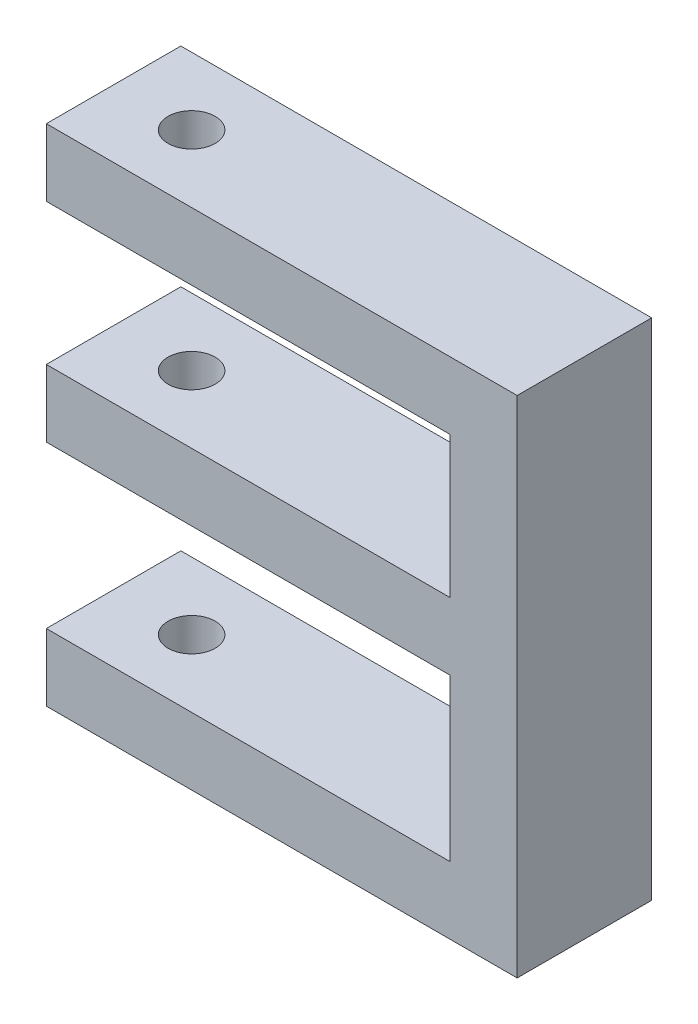
ISO-10303-21;
HEADER;
FILE_DESCRIPTION(('STEP AP214'),'2;1');
FILE_NAME('part.step','',(''),(''),'','','');
FILE_SCHEMA(('AUTOMOTIVE_DESIGN { 1 0 10303 214 1 1 1 1 }'));
ENDSEC;
DATA;
#1=APPLICATION_CONTEXT('core data for automotive mechanical design processes');
#2=APPLICATION_PROTOCOL_DEFINITION('international standard','automotive_design',2000,#1);
#3=PRODUCT_CONTEXT('',#1,'mechanical');
#4=PRODUCT('Part','Part','',(#3));
#5=PRODUCT_RELATED_PRODUCT_CATEGORY('part','',(#4));
#6=PRODUCT_DEFINITION_FORMATION('','',#4);
#7=PRODUCT_DEFINITION_CONTEXT('part definition',#1,'design');
#8=PRODUCT_DEFINITION('design','',#6,#7);
#9=PRODUCT_DEFINITION_SHAPE('','',#8);
#10=(LENGTH_UNIT() NAMED_UNIT(*) SI_UNIT(.MILLI.,.METRE.));
#11=(NAMED_UNIT(*) PLANE_ANGLE_UNIT() SI_UNIT($,.RADIAN.));
#12=(NAMED_UNIT(*) SI_UNIT($,.STERADIAN.) SOLID_ANGLE_UNIT());
#13=UNCERTAINTY_MEASURE_WITH_UNIT(LENGTH_MEASURE(1.E-05),#10,'distance_accuracy_value','');
#14=(GEOMETRIC_REPRESENTATION_CONTEXT(3) GLOBAL_UNCERTAINTY_ASSIGNED_CONTEXT((#13)) GLOBAL_UNIT_ASSIGNED_CONTEXT((#10,
#11,#12)) REPRESENTATION_CONTEXT('',''));
#15=CARTESIAN_POINT('',(0.,0.,0.));
#16=DIRECTION('',(0.,0.,1.));
#17=DIRECTION('',(1.,0.,0.));
#18=AXIS2_PLACEMENT_3D('',#15,#16,#17);
#19=CARTESIAN_POINT('',(30.,-32.5,10.));
#20=DIRECTION('',(1.,0.,0.));
#21=DIRECTION('',(0.,0.,-1.));
#22=AXIS2_PLACEMENT_3D('',#19,#20,#21);
#23=PLANE('',#22);
#24=DIRECTION('',(0.,0.,-1.));
#25=VECTOR('',#24,1.);
#26=CARTESIAN_POINT('',(30.,-15.5,0.));
#27=LINE('',#26,#25);
#28=CARTESIAN_POINT('',(30.,-15.5,10.));
#29=VERTEX_POINT('',#28);
#30=CARTESIAN_POINT('',(30.,-15.5,0.));
#31=VERTEX_POINT('',#30);
#32=EDGE_CURVE('E57',#29,#31,#27,.T.);
#33=ORIENTED_EDGE('',*,*,#32,.F.);
#34=DIRECTION('',(0.,-1.,0.));
#35=VECTOR('',#34,1.);
#36=CARTESIAN_POINT('',(30.,-32.5,10.));
#37=LINE('',#36,#35);
#38=CARTESIAN_POINT('',(30.,-5.,10.));
#39=VERTEX_POINT('',#38);
#40=EDGE_CURVE('E163',#39,#29,#37,.T.);
#41=ORIENTED_EDGE('',*,*,#40,.F.);
#42=DIRECTION('',(0.,0.,-1.));
#43=VECTOR('',#42,1.);
#44=CARTESIAN_POINT('',(30.,-5.,10.));
#45=LINE('',#44,#43);
#46=CARTESIAN_POINT('',(30.,-5.,0.));
#47=VERTEX_POINT('',#46);
#48=EDGE_CURVE('E42',#39,#47,#45,.T.);
#49=ORIENTED_EDGE('',*,*,#48,.T.);
#50=DIRECTION('',(0.,-1.,0.));
#51=VECTOR('',#50,1.);
#52=CARTESIAN_POINT('',(30.,-32.5,0.));
#53=LINE('',#52,#51);
#54=EDGE_CURVE('E135',#47,#31,#53,.T.);
#55=ORIENTED_EDGE('',*,*,#54,.T.);
#56=EDGE_LOOP('',(#33,#41,#49,#55));
#57=FACE_BOUND('',#56,.T.);
#58=ADVANCED_FACE('F33',(#57),#23,.F.);
#59=DIRECTION('',(0.,0.,1.));
#60=VECTOR('',#59,1.);
#61=CARTESIAN_POINT('',(30.,-20.5,0.));
#62=LINE('',#61,#60);
#63=CARTESIAN_POINT('',(30.,-20.5,0.));
#64=VERTEX_POINT('',#63);
#65=CARTESIAN_POINT('',(30.,-20.5,10.));
#66=VERTEX_POINT('',#65);
#67=EDGE_CURVE('E139',#64,#66,#62,.T.);
#68=ORIENTED_EDGE('',*,*,#67,.F.);
#69=CARTESIAN_POINT('',(30.,-32.5,0.));
#70=VERTEX_POINT('',#69);
#71=EDGE_CURVE('E125',#64,#70,#53,.T.);
#72=ORIENTED_EDGE('',*,*,#71,.T.);
#73=DIRECTION('',(0.,0.,-1.));
#74=VECTOR('',#73,1.);
#75=CARTESIAN_POINT('',(30.,-32.5,10.));
#76=LINE('',#75,#74);
#77=CARTESIAN_POINT('',(30.,-32.5,10.));
#78=VERTEX_POINT('',#77);
#79=EDGE_CURVE('E203',#78,#70,#76,.T.);
#80=ORIENTED_EDGE('',*,*,#79,.F.);
#81=EDGE_CURVE('E49',#66,#78,#37,.T.);
#82=ORIENTED_EDGE('',*,*,#81,.F.);
#83=EDGE_LOOP('',(#68,#72,#80,#82));
#84=FACE_BOUND('',#83,.T.);
#85=ADVANCED_FACE('F140',(#84),#23,.F.);
#86=CARTESIAN_POINT('',(0.,-5.,10.));
#87=DIRECTION('',(1.,0.,0.));
#88=DIRECTION('',(0.,0.,-1.));
#89=AXIS2_PLACEMENT_3D('',#86,#87,#88);
#90=PLANE('',#89);
#91=DIRECTION('',(0.,-1.,0.));
#92=VECTOR('',#91,1.);
#93=CARTESIAN_POINT('',(0.,-5.,0.));
#94=LINE('',#93,#92);
#95=CARTESIAN_POINT('',(0.,0.,0.));
#96=VERTEX_POINT('',#95);
#97=CARTESIAN_POINT('',(0.,-5.,0.));
#98=VERTEX_POINT('',#97);
#99=EDGE_CURVE('E176',#96,#98,#94,.T.);
#100=ORIENTED_EDGE('',*,*,#99,.T.);
#101=DIRECTION('',(0.,0.,-1.));
#102=VECTOR('',#101,1.);
#103=CARTESIAN_POINT('',(0.,-5.,10.));
#104=LINE('',#103,#102);
#105=CARTESIAN_POINT('',(0.,-5.,10.));
#106=VERTEX_POINT('',#105);
#107=EDGE_CURVE('E11',#106,#98,#104,.T.);
#108=ORIENTED_EDGE('',*,*,#107,.F.);
#109=DIRECTION('',(0.,-1.,0.));
#110=VECTOR('',#109,1.);
#111=CARTESIAN_POINT('',(0.,-5.,10.));
#112=LINE('',#111,#110);
#113=CARTESIAN_POINT('',(0.,0.,10.));
#114=VERTEX_POINT('',#113);
#115=EDGE_CURVE('E157',#114,#106,#112,.T.);
#116=ORIENTED_EDGE('',*,*,#115,.F.);
#117=DIRECTION('',(0.,0.,-1.));
#118=VECTOR('',#117,1.);
#119=CARTESIAN_POINT('',(0.,0.,10.));
#120=LINE('',#119,#118);
#121=EDGE_CURVE('E175',#114,#96,#120,.T.);
#122=ORIENTED_EDGE('',*,*,#121,.T.);
#123=EDGE_LOOP('',(#100,#108,#116,#122));
#124=FACE_BOUND('',#123,.T.);
#125=ADVANCED_FACE('F35',(#124),#90,.F.);
#126=CARTESIAN_POINT('',(30.,-5.,10.));
#127=DIRECTION('',(0.,1.,0.));
#128=DIRECTION('',(-1.,0.,0.));
#129=AXIS2_PLACEMENT_3D('',#126,#127,#128);
#130=PLANE('',#129);
#131=CARTESIAN_POINT('',(5.8,-5.,5.));
#132=DIRECTION('',(0.,1.,0.));
#133=DIRECTION('',(-1.,0.,0.));
#134=AXIS2_PLACEMENT_3D('',#131,#132,#133);
#135=CIRCLE('',#134,1.75);
#136=CARTESIAN_POINT('',(4.05,-5.,5.));
#137=VERTEX_POINT('',#136);
#138=EDGE_CURVE('E143',#137,#137,#135,.F.);
#139=ORIENTED_EDGE('',*,*,#138,.F.);
#140=EDGE_LOOP('',(#139));
#141=FACE_BOUND('',#140,.T.);
#142=DIRECTION('',(1.,0.,0.));
#143=VECTOR('',#142,1.);
#144=CARTESIAN_POINT('',(30.,-5.,0.));
#145=LINE('',#144,#143);
#146=EDGE_CURVE('E136',#98,#47,#145,.T.);
#147=ORIENTED_EDGE('',*,*,#146,.T.);
#148=ORIENTED_EDGE('',*,*,#48,.F.);
#149=DIRECTION('',(1.,0.,0.));
#150=VECTOR('',#149,1.);
#151=CARTESIAN_POINT('',(30.,-5.,10.));
#152=LINE('',#151,#150);
#153=EDGE_CURVE('E160',#106,#39,#152,.T.);
#154=ORIENTED_EDGE('',*,*,#153,.F.);
#155=ORIENTED_EDGE('',*,*,#107,.T.);
#156=EDGE_LOOP('',(#147,#148,#154,#155));
#157=FACE_BOUND('',#156,.T.);
#158=ADVANCED_FACE('F263',(#141,#157),#130,.F.);
#159=CARTESIAN_POINT('',(0.,-32.5,10.));
#160=DIRECTION('',(0.,-1.,0.));
#161=DIRECTION('',(0.,0.,-1.));
#162=AXIS2_PLACEMENT_3D('',#159,#160,#161);
#163=PLANE('',#162);
#164=CARTESIAN_POINT('',(5.8,-32.5,5.));
#165=DIRECTION('',(0.,-1.,0.));
#166=DIRECTION('',(0.,0.,-1.));
#167=AXIS2_PLACEMENT_3D('',#164,#165,#166);
#168=CIRCLE('',#167,1.75);
#169=CARTESIAN_POINT('',(5.8,-32.5,3.25));
#170=VERTEX_POINT('',#169);
#171=EDGE_CURVE('E225',#170,#170,#168,.F.);
#172=ORIENTED_EDGE('',*,*,#171,.F.);
#173=EDGE_LOOP('',(#172));
#174=FACE_BOUND('',#173,.T.);
#175=DIRECTION('',(-1.,0.,0.));
#176=VECTOR('',#175,1.);
#177=CARTESIAN_POINT('',(0.,-32.5,0.));
#178=LINE('',#177,#176);
#179=CARTESIAN_POINT('',(0.,-32.5,0.));
#180=VERTEX_POINT('',#179);
#181=EDGE_CURVE('E133',#70,#180,#178,.T.);
#182=ORIENTED_EDGE('',*,*,#181,.T.);
#183=DIRECTION('',(0.,0.,-1.));
#184=VECTOR('',#183,1.);
#185=CARTESIAN_POINT('',(0.,-32.5,10.));
#186=LINE('',#185,#184);
#187=CARTESIAN_POINT('',(0.,-32.5,10.));
#188=VERTEX_POINT('',#187);
#189=EDGE_CURVE('E200',#188,#180,#186,.T.);
#190=ORIENTED_EDGE('',*,*,#189,.F.);
#191=DIRECTION('',(-1.,0.,0.));
#192=VECTOR('',#191,1.);
#193=CARTESIAN_POINT('',(0.,-32.5,10.));
#194=LINE('',#193,#192);
#195=EDGE_CURVE('E165',#78,#188,#194,.T.);
#196=ORIENTED_EDGE('',*,*,#195,.F.);
#197=ORIENTED_EDGE('',*,*,#79,.T.);
#198=EDGE_LOOP('',(#182,#190,#196,#197));
#199=FACE_BOUND('',#198,.T.);
#200=ADVANCED_FACE('F261',(#174,#199),#163,.F.);
#201=CARTESIAN_POINT('',(0.,-37.5,10.));
#202=DIRECTION('',(1.,0.,0.));
#203=DIRECTION('',(0.,0.,-1.));
#204=AXIS2_PLACEMENT_3D('',#201,#202,#203);
#205=PLANE('',#204);
#206=DIRECTION('',(0.,-1.,0.));
#207=VECTOR('',#206,1.);
#208=CARTESIAN_POINT('',(0.,-37.5,0.));
#209=LINE('',#208,#207);
#210=CARTESIAN_POINT('',(0.,-37.5,0.));
#211=VERTEX_POINT('',#210);
#212=EDGE_CURVE('E182',#180,#211,#209,.T.);
#213=ORIENTED_EDGE('',*,*,#212,.T.);
#214=DIRECTION('',(0.,0.,-1.));
#215=VECTOR('',#214,1.);
#216=CARTESIAN_POINT('',(0.,-37.5,10.));
#217=LINE('',#216,#215);
#218=CARTESIAN_POINT('',(0.,-37.5,10.));
#219=VERTEX_POINT('',#218);
#220=EDGE_CURVE('E197',#219,#211,#217,.T.);
#221=ORIENTED_EDGE('',*,*,#220,.F.);
#222=DIRECTION('',(0.,-1.,0.));
#223=VECTOR('',#222,1.);
#224=CARTESIAN_POINT('',(0.,-37.5,10.));
#225=LINE('',#224,#223);
#226=EDGE_CURVE('E167',#188,#219,#225,.T.);
#227=ORIENTED_EDGE('',*,*,#226,.F.);
#228=ORIENTED_EDGE('',*,*,#189,.T.);
#229=EDGE_LOOP('',(#213,#221,#227,#228));
#230=FACE_BOUND('',#229,.T.);
#231=ADVANCED_FACE('F270',(#230),#205,.F.);
#232=CARTESIAN_POINT('',(35.,-37.5,10.));
#233=DIRECTION('',(0.,1.,0.));
#234=DIRECTION('',(-1.,0.,0.));
#235=AXIS2_PLACEMENT_3D('',#232,#233,#234);
#236=PLANE('',#235);
#237=CARTESIAN_POINT('',(5.8,-37.5,5.));
#238=DIRECTION('',(0.,1.,0.));
#239=DIRECTION('',(-1.,0.,0.));
#240=AXIS2_PLACEMENT_3D('',#237,#238,#239);
#241=CIRCLE('',#240,1.75);
#242=CARTESIAN_POINT('',(4.05,-37.5,5.));
#243=VERTEX_POINT('',#242);
#244=EDGE_CURVE('E228',#243,#243,#241,.F.);
#245=ORIENTED_EDGE('',*,*,#244,.F.);
#246=EDGE_LOOP('',(#245));
#247=FACE_BOUND('',#246,.T.);
#248=DIRECTION('',(1.,0.,0.));
#249=VECTOR('',#248,1.);
#250=CARTESIAN_POINT('',(35.,-37.5,0.));
#251=LINE('',#250,#249);
#252=CARTESIAN_POINT('',(35.,-37.5,0.));
#253=VERTEX_POINT('',#252);
#254=EDGE_CURVE('E184',#211,#253,#251,.T.);
#255=ORIENTED_EDGE('',*,*,#254,.T.);
#256=DIRECTION('',(0.,0.,-1.));
#257=VECTOR('',#256,1.);
#258=CARTESIAN_POINT('',(35.,-37.5,10.));
#259=LINE('',#258,#257);
#260=CARTESIAN_POINT('',(35.,-37.5,10.));
#261=VERTEX_POINT('',#260);
#262=EDGE_CURVE('E194',#261,#253,#259,.T.);
#263=ORIENTED_EDGE('',*,*,#262,.F.);
#264=DIRECTION('',(1.,0.,0.));
#265=VECTOR('',#264,1.);
#266=CARTESIAN_POINT('',(35.,-37.5,10.));
#267=LINE('',#266,#265);
#268=EDGE_CURVE('E169',#219,#261,#267,.T.);
#269=ORIENTED_EDGE('',*,*,#268,.F.);
#270=ORIENTED_EDGE('',*,*,#220,.T.);
#271=EDGE_LOOP('',(#255,#263,#269,#270));
#272=FACE_BOUND('',#271,.T.);
#273=ADVANCED_FACE('F290',(#247,#272),#236,.F.);
#274=CARTESIAN_POINT('',(35.,0.,10.));
#275=DIRECTION('',(-1.,0.,0.));
#276=DIRECTION('',(0.,-1.,0.));
#277=AXIS2_PLACEMENT_3D('',#274,#275,#276);
#278=PLANE('',#277);
#279=DIRECTION('',(0.,1.,0.));
#280=VECTOR('',#279,1.);
#281=CARTESIAN_POINT('',(35.,0.,0.));
#282=LINE('',#281,#280);
#283=CARTESIAN_POINT('',(35.,0.,0.));
#284=VERTEX_POINT('',#283);
#285=EDGE_CURVE('E186',#253,#284,#282,.T.);
#286=ORIENTED_EDGE('',*,*,#285,.T.);
#287=DIRECTION('',(0.,0.,-1.));
#288=VECTOR('',#287,1.);
#289=CARTESIAN_POINT('',(35.,0.,10.));
#290=LINE('',#289,#288);
#291=CARTESIAN_POINT('',(35.,0.,10.));
#292=VERTEX_POINT('',#291);
#293=EDGE_CURVE('E191',#292,#284,#290,.T.);
#294=ORIENTED_EDGE('',*,*,#293,.F.);
#295=DIRECTION('',(0.,1.,0.));
#296=VECTOR('',#295,1.);
#297=CARTESIAN_POINT('',(35.,0.,10.));
#298=LINE('',#297,#296);
#299=EDGE_CURVE('E171',#261,#292,#298,.T.);
#300=ORIENTED_EDGE('',*,*,#299,.F.);
#301=ORIENTED_EDGE('',*,*,#262,.T.);
#302=EDGE_LOOP('',(#286,#294,#300,#301));
#303=FACE_BOUND('',#302,.T.);
#304=ADVANCED_FACE('F286',(#303),#278,.F.);
#305=CARTESIAN_POINT('',(0.,0.,10.));
#306=DIRECTION('',(0.,-1.,0.));
#307=DIRECTION('',(0.,0.,-1.));
#308=AXIS2_PLACEMENT_3D('',#305,#306,#307);
#309=PLANE('',#308);
#310=CARTESIAN_POINT('',(5.8,0.,5.));
#311=DIRECTION('',(0.,-1.,0.));
#312=DIRECTION('',(0.,0.,-1.));
#313=AXIS2_PLACEMENT_3D('',#310,#311,#312);
#314=CIRCLE('',#313,1.75);
#315=CARTESIAN_POINT('',(5.8,0.,3.25));
#316=VERTEX_POINT('',#315);
#317=EDGE_CURVE('E231',#316,#316,#314,.F.);
#318=ORIENTED_EDGE('',*,*,#317,.F.);
#319=EDGE_LOOP('',(#318));
#320=FACE_BOUND('',#319,.T.);
#321=DIRECTION('',(-1.,0.,0.));
#322=VECTOR('',#321,1.);
#323=CARTESIAN_POINT('',(0.,0.,0.));
#324=LINE('',#323,#322);
#325=EDGE_CURVE('E161',#284,#96,#324,.T.);
#326=ORIENTED_EDGE('',*,*,#325,.T.);
#327=ORIENTED_EDGE('',*,*,#121,.F.);
#328=DIRECTION('',(-1.,0.,0.));
#329=VECTOR('',#328,1.);
#330=CARTESIAN_POINT('',(0.,0.,10.));
#331=LINE('',#330,#329);
#332=EDGE_CURVE('E173',#292,#114,#331,.T.);
#333=ORIENTED_EDGE('',*,*,#332,.F.);
#334=ORIENTED_EDGE('',*,*,#293,.T.);
#335=EDGE_LOOP('',(#326,#327,#333,#334));
#336=FACE_BOUND('',#335,.T.);
#337=ADVANCED_FACE('F281',(#320,#336),#309,.F.);
#338=CARTESIAN_POINT('',(0.,0.,10.));
#339=DIRECTION('',(0.,0.,-1.));
#340=DIRECTION('',(-1.,0.,0.));
#341=AXIS2_PLACEMENT_3D('',#338,#339,#340);
#342=PLANE('',#341);
#343=ORIENTED_EDGE('',*,*,#115,.T.);
#344=ORIENTED_EDGE('',*,*,#153,.T.);
#345=ORIENTED_EDGE('',*,*,#40,.T.);
#346=DIRECTION('',(1.,0.,0.));
#347=VECTOR('',#346,1.);
#348=CARTESIAN_POINT('',(-11.1803398874989,-15.5,10.));
#349=LINE('',#348,#347);
#350=CARTESIAN_POINT('',(0.,-15.5,10.));
#351=VERTEX_POINT('',#350);
#352=EDGE_CURVE('E153',#351,#29,#349,.T.);
#353=ORIENTED_EDGE('',*,*,#352,.F.);
#354=DIRECTION('',(0.,-1.,0.));
#355=VECTOR('',#354,1.);
#356=CARTESIAN_POINT('',(0.,-15.5,10.));
#357=LINE('',#356,#355);
#358=CARTESIAN_POINT('',(0.,-20.5,10.));
#359=VERTEX_POINT('',#358);
#360=EDGE_CURVE('E151',#351,#359,#357,.T.);
#361=ORIENTED_EDGE('',*,*,#360,.T.);
#362=DIRECTION('',(1.,0.,0.));
#363=VECTOR('',#362,1.);
#364=CARTESIAN_POINT('',(-11.1803398874989,-20.5,10.));
#365=LINE('',#364,#363);
#366=EDGE_CURVE('E148',#359,#66,#365,.T.);
#367=ORIENTED_EDGE('',*,*,#366,.T.);
#368=ORIENTED_EDGE('',*,*,#81,.T.);
#369=ORIENTED_EDGE('',*,*,#195,.T.);
#370=ORIENTED_EDGE('',*,*,#226,.T.);
#371=ORIENTED_EDGE('',*,*,#268,.T.);
#372=ORIENTED_EDGE('',*,*,#299,.T.);
#373=ORIENTED_EDGE('',*,*,#332,.T.);
#374=EDGE_LOOP('',(#343,#344,#345,#353,#361,#367,#368,#369,#370,#371,#372,#373));
#375=FACE_BOUND('',#374,.T.);
#376=ADVANCED_FACE('F298',(#375),#342,.F.);
#377=CARTESIAN_POINT('',(0.,0.,0.));
#378=DIRECTION('',(0.,0.,-1.));
#379=DIRECTION('',(-1.,0.,0.));
#380=AXIS2_PLACEMENT_3D('',#377,#378,#379);
#381=PLANE('',#380);
#382=ORIENTED_EDGE('',*,*,#99,.F.);
#383=ORIENTED_EDGE('',*,*,#325,.F.);
#384=ORIENTED_EDGE('',*,*,#285,.F.);
#385=ORIENTED_EDGE('',*,*,#254,.F.);
#386=ORIENTED_EDGE('',*,*,#212,.F.);
#387=ORIENTED_EDGE('',*,*,#181,.F.);
#388=ORIENTED_EDGE('',*,*,#71,.F.);
#389=DIRECTION('',(1.,0.,0.));
#390=VECTOR('',#389,1.);
#391=CARTESIAN_POINT('',(-11.1803398874989,-20.5,0.));
#392=LINE('',#391,#390);
#393=CARTESIAN_POINT('',(0.,-20.5,0.));
#394=VERTEX_POINT('',#393);
#395=EDGE_CURVE('E130',#394,#64,#392,.T.);
#396=ORIENTED_EDGE('',*,*,#395,.F.);
#397=DIRECTION('',(0.,1.,0.));
#398=VECTOR('',#397,1.);
#399=CARTESIAN_POINT('',(0.,-15.5,0.));
#400=LINE('',#399,#398);
#401=CARTESIAN_POINT('',(0.,-15.5,0.));
#402=VERTEX_POINT('',#401);
#403=EDGE_CURVE('E179',#394,#402,#400,.T.);
#404=ORIENTED_EDGE('',*,*,#403,.T.);
#405=DIRECTION('',(1.,0.,0.));
#406=VECTOR('',#405,1.);
#407=CARTESIAN_POINT('',(-11.1803398874989,-15.5,0.));
#408=LINE('',#407,#406);
#409=EDGE_CURVE('E211',#402,#31,#408,.T.);
#410=ORIENTED_EDGE('',*,*,#409,.T.);
#411=ORIENTED_EDGE('',*,*,#54,.F.);
#412=ORIENTED_EDGE('',*,*,#146,.F.);
#413=EDGE_LOOP('',(#382,#383,#384,#385,#386,#387,#388,#396,#404,#410,#411,#412));
#414=FACE_BOUND('',#413,.T.);
#415=ADVANCED_FACE('F127',(#414),#381,.T.);
#416=CARTESIAN_POINT('',(-11.1803398874989,-15.5,0.));
#417=DIRECTION('',(0.,-1.,0.));
#418=DIRECTION('',(0.,0.,-1.));
#419=AXIS2_PLACEMENT_3D('',#416,#417,#418);
#420=PLANE('',#419);
#421=CARTESIAN_POINT('',(5.8,-15.5,5.));
#422=DIRECTION('',(0.,-1.,0.));
#423=DIRECTION('',(0.,0.,-1.));
#424=AXIS2_PLACEMENT_3D('',#421,#422,#423);
#425=CIRCLE('',#424,1.75);
#426=CARTESIAN_POINT('',(5.8,-15.5,3.25));
#427=VERTEX_POINT('',#426);
#428=EDGE_CURVE('E234',#427,#427,#425,.F.);
#429=ORIENTED_EDGE('',*,*,#428,.F.);
#430=EDGE_LOOP('',(#429));
#431=FACE_BOUND('',#430,.T.);
#432=ORIENTED_EDGE('',*,*,#409,.F.);
#433=DIRECTION('',(0.,0.,1.));
#434=VECTOR('',#433,1.);
#435=CARTESIAN_POINT('',(0.,-15.5,0.));
#436=LINE('',#435,#434);
#437=EDGE_CURVE('E147',#402,#351,#436,.T.);
#438=ORIENTED_EDGE('',*,*,#437,.T.);
#439=ORIENTED_EDGE('',*,*,#352,.T.);
#440=ORIENTED_EDGE('',*,*,#32,.T.);
#441=EDGE_LOOP('',(#432,#438,#439,#440));
#442=FACE_BOUND('',#441,.T.);
#443=ADVANCED_FACE('F215',(#431,#442),#420,.F.);
#444=CARTESIAN_POINT('',(-11.1803398874989,-20.5,0.));
#445=DIRECTION('',(0.,1.,0.));
#446=DIRECTION('',(0.,0.,1.));
#447=AXIS2_PLACEMENT_3D('',#444,#445,#446);
#448=PLANE('',#447);
#449=CARTESIAN_POINT('',(5.8,-20.5,5.));
#450=DIRECTION('',(0.,1.,0.));
#451=DIRECTION('',(0.,0.,1.));
#452=AXIS2_PLACEMENT_3D('',#449,#450,#451);
#453=CIRCLE('',#452,1.75);
#454=CARTESIAN_POINT('',(5.8,-20.5,3.25));
#455=VERTEX_POINT('',#454);
#456=EDGE_CURVE('E37',#455,#455,#453,.F.);
#457=ORIENTED_EDGE('',*,*,#456,.F.);
#458=EDGE_LOOP('',(#457));
#459=FACE_BOUND('',#458,.T.);
#460=ORIENTED_EDGE('',*,*,#366,.F.);
#461=DIRECTION('',(0.,0.,-1.));
#462=VECTOR('',#461,1.);
#463=CARTESIAN_POINT('',(0.,-20.5,0.));
#464=LINE('',#463,#462);
#465=EDGE_CURVE('E146',#359,#394,#464,.T.);
#466=ORIENTED_EDGE('',*,*,#465,.T.);
#467=ORIENTED_EDGE('',*,*,#395,.T.);
#468=ORIENTED_EDGE('',*,*,#67,.T.);
#469=EDGE_LOOP('',(#460,#466,#467,#468));
#470=FACE_BOUND('',#469,.T.);
#471=ADVANCED_FACE('F145',(#459,#470),#448,.F.);
#472=CARTESIAN_POINT('',(0.,-5.,10.));
#473=DIRECTION('',(1.,0.,0.));
#474=DIRECTION('',(0.,0.,-1.));
#475=AXIS2_PLACEMENT_3D('',#472,#473,#474);
#476=PLANE('',#475);
#477=ORIENTED_EDGE('',*,*,#465,.F.);
#478=ORIENTED_EDGE('',*,*,#360,.F.);
#479=ORIENTED_EDGE('',*,*,#437,.F.);
#480=ORIENTED_EDGE('',*,*,#403,.F.);
#481=EDGE_LOOP('',(#477,#478,#479,#480));
#482=FACE_BOUND('',#481,.T.);
#483=ADVANCED_FACE('F244',(#482),#476,.F.);
#484=CARTESIAN_POINT('',(5.8,15.5,5.));
#485=DIRECTION('',(0.,-1.,0.));
#486=DIRECTION('',(0.,0.,-1.));
#487=AXIS2_PLACEMENT_3D('',#484,#485,#486);
#488=CYLINDRICAL_SURFACE('',#487,1.75);
#489=CARTESIAN_POINT('',(5.8,-20.5,3.25));
#490=CARTESIAN_POINT('',(5.8,-20.4479166666667,3.25));
#491=CARTESIAN_POINT('',(5.8,-20.3958333333333,3.25));
#492=CARTESIAN_POINT('',(5.8,-20.2916666666667,3.25));
#493=CARTESIAN_POINT('',(5.8,-20.2395833333333,3.25));
#494=CARTESIAN_POINT('',(5.8,-20.1354166666667,3.25));
#495=CARTESIAN_POINT('',(5.8,-20.0833333333333,3.25));
#496=CARTESIAN_POINT('',(5.8,-19.9791666666667,3.25));
#497=CARTESIAN_POINT('',(5.8,-19.9270833333333,3.25));
#498=CARTESIAN_POINT('',(5.8,-19.8229166666667,3.25));
#499=CARTESIAN_POINT('',(5.8,-19.7708333333333,3.25));
#500=CARTESIAN_POINT('',(5.8,-19.6666666666667,3.25));
#501=CARTESIAN_POINT('',(5.8,-19.6145833333333,3.25));
#502=CARTESIAN_POINT('',(5.8,-19.5104166666667,3.25));
#503=CARTESIAN_POINT('',(5.8,-19.4583333333333,3.25));
#504=CARTESIAN_POINT('',(5.8,-19.3541666666667,3.25));
#505=CARTESIAN_POINT('',(5.8,-19.3020833333333,3.25));
#506=CARTESIAN_POINT('',(5.8,-19.1979166666667,3.25));
#507=CARTESIAN_POINT('',(5.8,-19.1458333333333,3.25));
#508=CARTESIAN_POINT('',(5.8,-19.0416666666667,3.25));
#509=CARTESIAN_POINT('',(5.8,-18.9895833333333,3.25));
#510=CARTESIAN_POINT('',(5.8,-18.8854166666667,3.25));
#511=CARTESIAN_POINT('',(5.8,-18.8333333333333,3.25));
#512=CARTESIAN_POINT('',(5.8,-18.7291666666667,3.25));
#513=CARTESIAN_POINT('',(5.8,-18.6770833333333,3.25));
#514=CARTESIAN_POINT('',(5.8,-18.5729166666667,3.25));
#515=CARTESIAN_POINT('',(5.8,-18.5208333333333,3.25));
#516=CARTESIAN_POINT('',(5.8,-18.4166666666667,3.25));
#517=CARTESIAN_POINT('',(5.8,-18.3645833333333,3.25));
#518=CARTESIAN_POINT('',(5.8,-18.2604166666667,3.25));
#519=CARTESIAN_POINT('',(5.8,-18.2083333333333,3.25));
#520=CARTESIAN_POINT('',(5.8,-18.1041666666667,3.25));
#521=CARTESIAN_POINT('',(5.8,-18.0520833333333,3.25));
#522=CARTESIAN_POINT('',(5.8,-17.9479166666667,3.25));
#523=CARTESIAN_POINT('',(5.8,-17.8958333333333,3.25));
#524=CARTESIAN_POINT('',(5.8,-17.7916666666667,3.25));
#525=CARTESIAN_POINT('',(5.8,-17.7395833333333,3.25));
#526=CARTESIAN_POINT('',(5.8,-17.6354166666667,3.25));
#527=CARTESIAN_POINT('',(5.8,-17.5833333333333,3.25));
#528=CARTESIAN_POINT('',(5.8,-17.4791666666667,3.25));
#529=CARTESIAN_POINT('',(5.8,-17.4270833333333,3.25));
#530=CARTESIAN_POINT('',(5.8,-17.3229166666667,3.25));
#531=CARTESIAN_POINT('',(5.8,-17.2708333333333,3.25));
#532=CARTESIAN_POINT('',(5.8,-17.1666666666667,3.25));
#533=CARTESIAN_POINT('',(5.8,-17.1145833333333,3.25));
#534=CARTESIAN_POINT('',(5.8,-17.0104166666667,3.25));
#535=CARTESIAN_POINT('',(5.8,-16.9583333333333,3.25));
#536=CARTESIAN_POINT('',(5.8,-16.8541666666667,3.25));
#537=CARTESIAN_POINT('',(5.8,-16.8020833333333,3.25));
#538=CARTESIAN_POINT('',(5.8,-16.6979166666667,3.25));
#539=CARTESIAN_POINT('',(5.8,-16.6458333333333,3.25));
#540=CARTESIAN_POINT('',(5.8,-16.5416666666667,3.25));
#541=CARTESIAN_POINT('',(5.8,-16.4895833333333,3.25));
#542=CARTESIAN_POINT('',(5.8,-16.3854166666667,3.25));
#543=CARTESIAN_POINT('',(5.8,-16.3333333333333,3.25));
#544=CARTESIAN_POINT('',(5.8,-16.2291666666667,3.25));
#545=CARTESIAN_POINT('',(5.8,-16.1770833333333,3.25));
#546=CARTESIAN_POINT('',(5.8,-16.0729166666667,3.25));
#547=CARTESIAN_POINT('',(5.8,-16.0208333333333,3.25));
#548=CARTESIAN_POINT('',(5.8,-15.9166666666667,3.25));
#549=CARTESIAN_POINT('',(5.8,-15.8645833333333,3.25));
#550=CARTESIAN_POINT('',(5.8,-15.7604166666667,3.25));
#551=CARTESIAN_POINT('',(5.8,-15.7083333333333,3.25));
#552=CARTESIAN_POINT('',(5.8,-15.6041666666667,3.25));
#553=CARTESIAN_POINT('',(5.8,-15.5520833333333,3.25));
#554=CARTESIAN_POINT('',(5.8,-15.5,3.25));
#555=B_SPLINE_CURVE_WITH_KNOTS('',3,(#489,#490,#491,#492,#493,#494,#495,#496,#497,#498,#499,
#500,#501,#502,#503,#504,#505,#506,#507,#508,#509,#510,#511,#512,#513,#514,#515,#516,#517,#518,
#519,#520,#521,#522,#523,#524,#525,#526,#527,#528,#529,#530,#531,#532,#533,#534,#535,#536,#537,
#538,#539,#540,#541,#542,#543,#544,#545,#546,#547,#548,#549,#550,#551,#552,#553,#554),
.UNSPECIFIED.,.F.,.F.,(4,2,2,2,2,2,2,2,2,2,2,2,2,2,2,2,2,2,2,2,2,2,2,2,2,2,2,2,2,2,2,2,4),(0.,
0.156249999999997,0.3125,0.468749999999997,0.625000000000001,0.781249999999997,
0.937500000000001,1.09375,1.25,1.40625,1.5625,1.71875,1.875,2.03125,2.1875,2.34375,2.5,2.65625,
2.8125,2.96875,3.125,3.28125,3.4375,3.59375,3.75,3.90625,4.0625,4.21875,4.375,4.53125,4.6875,
4.84375,5.),.UNSPECIFIED.);
#556=EDGE_CURVE('BSEAM241',#455,#427,#555,.T.);
#557=ORIENTED_EDGE('',*,*,#456,.T.);
#558=ORIENTED_EDGE('',*,*,#428,.T.);
#559=ORIENTED_EDGE('',*,*,#556,.T.);
#560=ORIENTED_EDGE('',*,*,#556,.F.);
#561=EDGE_LOOP('',(#557,#559,#558,#560));
#562=FACE_BOUND('',#561,.T.);
#563=ADVANCED_FACE('F241',(#562),#488,.F.);
#564=ORIENTED_EDGE('',*,*,#317,.T.);
#565=EDGE_LOOP('',(#564));
#566=FACE_BOUND('',#565,.T.);
#567=ORIENTED_EDGE('',*,*,#138,.T.);
#568=EDGE_LOOP('',(#567));
#569=FACE_BOUND('',#568,.T.);
#570=ADVANCED_FACE('F352',(#566,#569),#488,.F.);
#571=ORIENTED_EDGE('',*,*,#244,.T.);
#572=EDGE_LOOP('',(#571));
#573=FACE_BOUND('',#572,.T.);
#574=ORIENTED_EDGE('',*,*,#171,.T.);
#575=EDGE_LOOP('',(#574));
#576=FACE_BOUND('',#575,.T.);
#577=ADVANCED_FACE('F354',(#573,#576),#488,.F.);
#578=CLOSED_SHELL('',(#58,#85,#125,#158,#200,#231,#273,#304,#337,#376,#415,#443,#471,#483,#563,
#570,#577));
#579=MANIFOLD_SOLID_BREP('B2',#578);
#580=ADVANCED_BREP_SHAPE_REPRESENTATION('',(#18,#579),#14);
#581=SHAPE_DEFINITION_REPRESENTATION(#9,#580);
ENDSEC;
END-ISO-10303-21;
